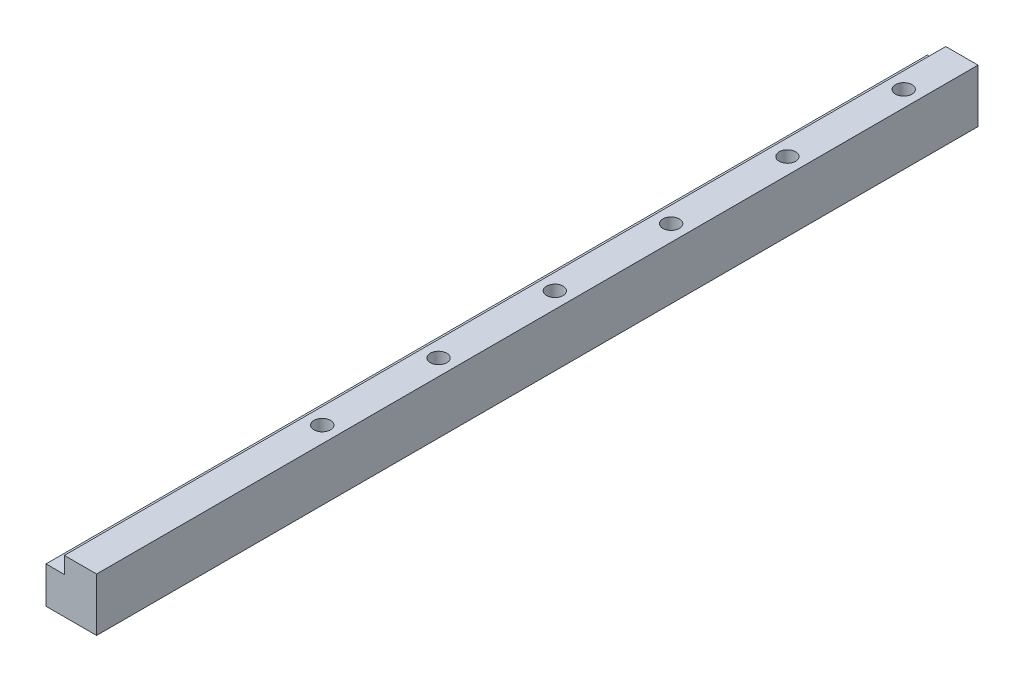
ISO-10303-21;
HEADER;
FILE_DESCRIPTION(('STEP AP214'),'2;1');
FILE_NAME('part.step','',(''),(''),'','','');
FILE_SCHEMA(('AUTOMOTIVE_DESIGN { 1 0 10303 214 1 1 1 1 }'));
ENDSEC;
DATA;
#1=APPLICATION_CONTEXT('core data for automotive mechanical design processes');
#2=APPLICATION_PROTOCOL_DEFINITION('international standard','automotive_design',2000,#1);
#3=PRODUCT_CONTEXT('',#1,'mechanical');
#4=PRODUCT('Part','Part','',(#3));
#5=PRODUCT_RELATED_PRODUCT_CATEGORY('part','',(#4));
#6=PRODUCT_DEFINITION_FORMATION('','',#4);
#7=PRODUCT_DEFINITION_CONTEXT('part definition',#1,'design');
#8=PRODUCT_DEFINITION('design','',#6,#7);
#9=PRODUCT_DEFINITION_SHAPE('','',#8);
#10=(LENGTH_UNIT() NAMED_UNIT(*) SI_UNIT(.MILLI.,.METRE.));
#11=(NAMED_UNIT(*) PLANE_ANGLE_UNIT() SI_UNIT($,.RADIAN.));
#12=(NAMED_UNIT(*) SI_UNIT($,.STERADIAN.) SOLID_ANGLE_UNIT());
#13=UNCERTAINTY_MEASURE_WITH_UNIT(LENGTH_MEASURE(1.E-05),#10,'distance_accuracy_value','');
#14=(GEOMETRIC_REPRESENTATION_CONTEXT(3) GLOBAL_UNCERTAINTY_ASSIGNED_CONTEXT((#13)) GLOBAL_UNIT_ASSIGNED_CONTEXT((#10,
#11,#12)) REPRESENTATION_CONTEXT('',''));
#15=CARTESIAN_POINT('',(0.,0.,0.));
#16=DIRECTION('',(0.,0.,1.));
#17=DIRECTION('',(1.,0.,0.));
#18=AXIS2_PLACEMENT_3D('',#15,#16,#17);
#19=CARTESIAN_POINT('',(-13.7770771845717,0.,100.));
#20=DIRECTION('',(1.,0.,0.));
#21=DIRECTION('',(0.,1.,0.));
#22=AXIS2_PLACEMENT_3D('',#19,#20,#21);
#23=PLANE('',#22);
#24=DIRECTION('',(0.,-1.,0.));
#25=VECTOR('',#24,1.);
#26=CARTESIAN_POINT('',(-13.7770771845717,0.,-100.));
#27=LINE('',#26,#25);
#28=CARTESIAN_POINT('',(-13.7770771845717,10.,-100.));
#29=VERTEX_POINT('',#28);
#30=CARTESIAN_POINT('',(-13.7770771845717,0.,-100.));
#31=VERTEX_POINT('',#30);
#32=EDGE_CURVE('E151',#29,#31,#27,.T.);
#33=ORIENTED_EDGE('',*,*,#32,.T.);
#34=DIRECTION('',(0.,0.,-1.));
#35=VECTOR('',#34,1.);
#36=CARTESIAN_POINT('',(-13.7770771845717,0.,100.));
#37=LINE('',#36,#35);
#38=CARTESIAN_POINT('',(-13.7770771845717,0.,140.));
#39=VERTEX_POINT('',#38);
#40=EDGE_CURVE('E11',#39,#31,#37,.T.);
#41=ORIENTED_EDGE('',*,*,#40,.F.);
#42=DIRECTION('',(0.,-1.,0.));
#43=VECTOR('',#42,1.);
#44=CARTESIAN_POINT('',(-13.7770771845717,10.,140.));
#45=LINE('',#44,#43);
#46=CARTESIAN_POINT('',(-13.7770771845717,10.,140.));
#47=VERTEX_POINT('',#46);
#48=EDGE_CURVE('E95',#47,#39,#45,.T.);
#49=ORIENTED_EDGE('',*,*,#48,.F.);
#50=DIRECTION('',(0.,0.,-1.));
#51=VECTOR('',#50,1.);
#52=CARTESIAN_POINT('',(-13.7770771845717,10.,100.));
#53=LINE('',#52,#51);
#54=EDGE_CURVE('E84',#47,#29,#53,.T.);
#55=ORIENTED_EDGE('',*,*,#54,.T.);
#56=EDGE_LOOP('',(#33,#41,#49,#55));
#57=FACE_BOUND('',#56,.T.);
#58=ADVANCED_FACE('F33',(#57),#23,.F.);
#59=CARTESIAN_POINT('',(0.,0.,100.));
#60=DIRECTION('',(0.,1.,0.));
#61=DIRECTION('',(0.,0.,1.));
#62=AXIS2_PLACEMENT_3D('',#59,#60,#61);
#63=PLANE('',#62);
#64=CARTESIAN_POINT('',(-4.3885385922859,0.,-84.1666666666667));
#65=DIRECTION('',(0.,1.,0.));
#66=DIRECTION('',(0.,0.,1.));
#67=AXIS2_PLACEMENT_3D('',#64,#65,#66);
#68=CIRCLE('',#67,2.25);
#69=CARTESIAN_POINT('',(-4.3885385922859,0.,-81.9166666666667));
#70=VERTEX_POINT('',#69);
#71=EDGE_CURVE('E118',#70,#70,#68,.T.);
#72=ORIENTED_EDGE('',*,*,#71,.T.);
#73=EDGE_LOOP('',(#72));
#74=FACE_BOUND('',#73,.T.);
#75=CARTESIAN_POINT('',(-4.38853859228589,0.,-52.5));
#76=DIRECTION('',(0.,1.,0.));
#77=DIRECTION('',(0.,0.,1.));
#78=AXIS2_PLACEMENT_3D('',#75,#76,#77);
#79=CIRCLE('',#78,2.25);
#80=CARTESIAN_POINT('',(-4.38853859228589,0.,-50.25));
#81=VERTEX_POINT('',#80);
#82=EDGE_CURVE('E124',#81,#81,#79,.T.);
#83=ORIENTED_EDGE('',*,*,#82,.T.);
#84=EDGE_LOOP('',(#83));
#85=FACE_BOUND('',#84,.T.);
#86=CARTESIAN_POINT('',(-4.38853859228589,0.,-20.8333333333333));
#87=DIRECTION('',(0.,1.,0.));
#88=DIRECTION('',(0.,0.,1.));
#89=AXIS2_PLACEMENT_3D('',#86,#87,#88);
#90=CIRCLE('',#89,2.25);
#91=CARTESIAN_POINT('',(-4.38853859228589,0.,-18.5833333333333));
#92=VERTEX_POINT('',#91);
#93=EDGE_CURVE('E130',#92,#92,#90,.T.);
#94=ORIENTED_EDGE('',*,*,#93,.T.);
#95=EDGE_LOOP('',(#94));
#96=FACE_BOUND('',#95,.T.);
#97=CARTESIAN_POINT('',(-4.38853859228588,0.,10.8333333333333));
#98=DIRECTION('',(0.,1.,0.));
#99=DIRECTION('',(0.,0.,1.));
#100=AXIS2_PLACEMENT_3D('',#97,#98,#99);
#101=CIRCLE('',#100,2.25);
#102=CARTESIAN_POINT('',(-4.38853859228588,0.,13.0833333333333));
#103=VERTEX_POINT('',#102);
#104=EDGE_CURVE('E136',#103,#103,#101,.T.);
#105=ORIENTED_EDGE('',*,*,#104,.T.);
#106=EDGE_LOOP('',(#105));
#107=FACE_BOUND('',#106,.T.);
#108=CARTESIAN_POINT('',(-4.38853859228588,0.,42.5));
#109=DIRECTION('',(0.,1.,0.));
#110=DIRECTION('',(0.,0.,1.));
#111=AXIS2_PLACEMENT_3D('',#108,#109,#110);
#112=CIRCLE('',#111,2.25);
#113=CARTESIAN_POINT('',(-4.38853859228588,0.,44.75));
#114=VERTEX_POINT('',#113);
#115=EDGE_CURVE('E142',#114,#114,#112,.T.);
#116=ORIENTED_EDGE('',*,*,#115,.T.);
#117=EDGE_LOOP('',(#116));
#118=FACE_BOUND('',#117,.T.);
#119=CARTESIAN_POINT('',(-4.38853859228588,0.,74.1666666666667));
#120=DIRECTION('',(0.,1.,0.));
#121=DIRECTION('',(0.,0.,1.));
#122=AXIS2_PLACEMENT_3D('',#119,#120,#121);
#123=CIRCLE('',#122,2.25);
#124=CARTESIAN_POINT('',(-4.38853859228588,0.,76.4166666666667));
#125=VERTEX_POINT('',#124);
#126=EDGE_CURVE('E148',#125,#125,#123,.T.);
#127=ORIENTED_EDGE('',*,*,#126,.T.);
#128=EDGE_LOOP('',(#127));
#129=FACE_BOUND('',#128,.T.);
#130=DIRECTION('',(1.,0.,0.));
#131=VECTOR('',#130,1.);
#132=CARTESIAN_POINT('',(0.,0.,-100.));
#133=LINE('',#132,#131);
#134=CARTESIAN_POINT('',(0.,0.,-100.));
#135=VERTEX_POINT('',#134);
#136=EDGE_CURVE('E153',#31,#135,#133,.T.);
#137=ORIENTED_EDGE('',*,*,#136,.T.);
#138=DIRECTION('',(0.,0.,-1.));
#139=VECTOR('',#138,1.);
#140=CARTESIAN_POINT('',(0.,0.,100.));
#141=LINE('',#140,#139);
#142=CARTESIAN_POINT('',(0.,0.,140.));
#143=VERTEX_POINT('',#142);
#144=EDGE_CURVE('E40',#143,#135,#141,.T.);
#145=ORIENTED_EDGE('',*,*,#144,.F.);
#146=DIRECTION('',(1.,0.,0.));
#147=VECTOR('',#146,1.);
#148=CARTESIAN_POINT('',(-13.7770771845717,0.,140.));
#149=LINE('',#148,#147);
#150=EDGE_CURVE('E99',#39,#143,#149,.T.);
#151=ORIENTED_EDGE('',*,*,#150,.F.);
#152=ORIENTED_EDGE('',*,*,#40,.T.);
#153=EDGE_LOOP('',(#137,#145,#151,#152));
#154=FACE_BOUND('',#153,.T.);
#155=ADVANCED_FACE('F189',(#74,#85,#96,#107,#118,#129,#154),#63,.F.);
#156=CARTESIAN_POINT('',(0.,14.5,100.));
#157=DIRECTION('',(-1.,0.,0.));
#158=DIRECTION('',(0.,-1.,0.));
#159=AXIS2_PLACEMENT_3D('',#156,#157,#158);
#160=PLANE('',#159);
#161=DIRECTION('',(0.,1.,0.));
#162=VECTOR('',#161,1.);
#163=CARTESIAN_POINT('',(0.,14.5,-100.));
#164=LINE('',#163,#162);
#165=CARTESIAN_POINT('',(0.,14.5,-100.));
#166=VERTEX_POINT('',#165);
#167=EDGE_CURVE('E155',#135,#166,#164,.T.);
#168=ORIENTED_EDGE('',*,*,#167,.T.);
#169=DIRECTION('',(0.,0.,-1.));
#170=VECTOR('',#169,1.);
#171=CARTESIAN_POINT('',(0.,14.5,100.));
#172=LINE('',#171,#170);
#173=CARTESIAN_POINT('',(0.,14.5,140.));
#174=VERTEX_POINT('',#173);
#175=EDGE_CURVE('E164',#174,#166,#172,.T.);
#176=ORIENTED_EDGE('',*,*,#175,.F.);
#177=DIRECTION('',(0.,1.,0.));
#178=VECTOR('',#177,1.);
#179=CARTESIAN_POINT('',(0.,0.,140.));
#180=LINE('',#179,#178);
#181=EDGE_CURVE('E109',#143,#174,#180,.T.);
#182=ORIENTED_EDGE('',*,*,#181,.F.);
#183=ORIENTED_EDGE('',*,*,#144,.T.);
#184=EDGE_LOOP('',(#168,#176,#182,#183));
#185=FACE_BOUND('',#184,.T.);
#186=ADVANCED_FACE('F170',(#185),#160,.F.);
#187=CARTESIAN_POINT('',(-8.77707718457179,14.5,100.));
#188=DIRECTION('',(0.,-1.,0.));
#189=DIRECTION('',(0.,0.,-1.));
#190=AXIS2_PLACEMENT_3D('',#187,#188,#189);
#191=PLANE('',#190);
#192=CARTESIAN_POINT('',(-4.3885385922859,14.5,-84.1666666666667));
#193=DIRECTION('',(0.,1.,0.));
#194=DIRECTION('',(0.,0.,1.));
#195=AXIS2_PLACEMENT_3D('',#192,#193,#194);
#196=CIRCLE('',#195,2.24999999999999);
#197=CARTESIAN_POINT('',(-4.3885385922859,14.5,-81.9166666666667));
#198=VERTEX_POINT('',#197);
#199=EDGE_CURVE('E115',#198,#198,#196,.T.);
#200=ORIENTED_EDGE('',*,*,#199,.F.);
#201=EDGE_LOOP('',(#200));
#202=FACE_BOUND('',#201,.T.);
#203=CARTESIAN_POINT('',(-4.38853859228589,14.5,-52.5));
#204=DIRECTION('',(0.,1.,0.));
#205=DIRECTION('',(0.,0.,1.));
#206=AXIS2_PLACEMENT_3D('',#203,#204,#205);
#207=CIRCLE('',#206,2.24999999999999);
#208=CARTESIAN_POINT('',(-4.38853859228589,14.5,-50.25));
#209=VERTEX_POINT('',#208);
#210=EDGE_CURVE('E121',#209,#209,#207,.T.);
#211=ORIENTED_EDGE('',*,*,#210,.F.);
#212=EDGE_LOOP('',(#211));
#213=FACE_BOUND('',#212,.T.);
#214=CARTESIAN_POINT('',(-4.38853859228589,14.5,-20.8333333333333));
#215=DIRECTION('',(0.,1.,0.));
#216=DIRECTION('',(0.,0.,1.));
#217=AXIS2_PLACEMENT_3D('',#214,#215,#216);
#218=CIRCLE('',#217,2.24999999999999);
#219=CARTESIAN_POINT('',(-4.38853859228589,14.5,-18.5833333333334));
#220=VERTEX_POINT('',#219);
#221=EDGE_CURVE('E127',#220,#220,#218,.T.);
#222=ORIENTED_EDGE('',*,*,#221,.F.);
#223=EDGE_LOOP('',(#222));
#224=FACE_BOUND('',#223,.T.);
#225=CARTESIAN_POINT('',(-4.38853859228588,14.5,10.8333333333333));
#226=DIRECTION('',(0.,1.,0.));
#227=DIRECTION('',(0.,0.,1.));
#228=AXIS2_PLACEMENT_3D('',#225,#226,#227);
#229=CIRCLE('',#228,2.24999999999999);
#230=CARTESIAN_POINT('',(-4.38853859228588,14.5,13.0833333333333));
#231=VERTEX_POINT('',#230);
#232=EDGE_CURVE('E133',#231,#231,#229,.T.);
#233=ORIENTED_EDGE('',*,*,#232,.F.);
#234=EDGE_LOOP('',(#233));
#235=FACE_BOUND('',#234,.T.);
#236=CARTESIAN_POINT('',(-4.38853859228588,14.5,42.5));
#237=DIRECTION('',(0.,1.,0.));
#238=DIRECTION('',(0.,0.,1.));
#239=AXIS2_PLACEMENT_3D('',#236,#237,#238);
#240=CIRCLE('',#239,2.24999999999999);
#241=CARTESIAN_POINT('',(-4.38853859228588,14.5,44.75));
#242=VERTEX_POINT('',#241);
#243=EDGE_CURVE('E139',#242,#242,#240,.T.);
#244=ORIENTED_EDGE('',*,*,#243,.F.);
#245=EDGE_LOOP('',(#244));
#246=FACE_BOUND('',#245,.T.);
#247=CARTESIAN_POINT('',(-4.38853859228588,14.5,74.1666666666667));
#248=DIRECTION('',(0.,1.,0.));
#249=DIRECTION('',(0.,0.,1.));
#250=AXIS2_PLACEMENT_3D('',#247,#248,#249);
#251=CIRCLE('',#250,2.24999999999999);
#252=CARTESIAN_POINT('',(-4.38853859228588,14.5,76.4166666666666));
#253=VERTEX_POINT('',#252);
#254=EDGE_CURVE('E145',#253,#253,#251,.T.);
#255=ORIENTED_EDGE('',*,*,#254,.F.);
#256=EDGE_LOOP('',(#255));
#257=FACE_BOUND('',#256,.T.);
#258=DIRECTION('',(-1.,0.,0.));
#259=VECTOR('',#258,1.);
#260=CARTESIAN_POINT('',(-8.77707718457179,14.5,-100.));
#261=LINE('',#260,#259);
#262=CARTESIAN_POINT('',(-8.77707718457179,14.5,-100.));
#263=VERTEX_POINT('',#262);
#264=EDGE_CURVE('E157',#166,#263,#261,.T.);
#265=ORIENTED_EDGE('',*,*,#264,.T.);
#266=DIRECTION('',(0.,0.,-1.));
#267=VECTOR('',#266,1.);
#268=CARTESIAN_POINT('',(-8.77707718457179,14.5,100.));
#269=LINE('',#268,#267);
#270=CARTESIAN_POINT('',(-8.77707718457179,14.5,140.));
#271=VERTEX_POINT('',#270);
#272=EDGE_CURVE('E162',#271,#263,#269,.T.);
#273=ORIENTED_EDGE('',*,*,#272,.F.);
#274=DIRECTION('',(-1.,0.,0.));
#275=VECTOR('',#274,1.);
#276=CARTESIAN_POINT('',(0.,14.5,140.));
#277=LINE('',#276,#275);
#278=EDGE_CURVE('E112',#174,#271,#277,.T.);
#279=ORIENTED_EDGE('',*,*,#278,.F.);
#280=ORIENTED_EDGE('',*,*,#175,.T.);
#281=EDGE_LOOP('',(#265,#273,#279,#280));
#282=FACE_BOUND('',#281,.T.);
#283=ADVANCED_FACE('F176',(#202,#213,#224,#235,#246,#257,#282),#191,.F.);
#284=CARTESIAN_POINT('',(-8.77707718457179,10.,100.));
#285=DIRECTION('',(1.,0.,0.));
#286=DIRECTION('',(0.,1.,0.));
#287=AXIS2_PLACEMENT_3D('',#284,#285,#286);
#288=PLANE('',#287);
#289=DIRECTION('',(0.,-1.,0.));
#290=VECTOR('',#289,1.);
#291=CARTESIAN_POINT('',(-8.77707718457179,10.,-100.));
#292=LINE('',#291,#290);
#293=CARTESIAN_POINT('',(-8.77707718457179,10.,-100.));
#294=VERTEX_POINT('',#293);
#295=EDGE_CURVE('E55',#263,#294,#292,.T.);
#296=ORIENTED_EDGE('',*,*,#295,.T.);
#297=DIRECTION('',(0.,0.,-1.));
#298=VECTOR('',#297,1.);
#299=CARTESIAN_POINT('',(-8.77707718457179,10.,100.));
#300=LINE('',#299,#298);
#301=CARTESIAN_POINT('',(-8.77707718457179,10.,140.));
#302=VERTEX_POINT('',#301);
#303=EDGE_CURVE('E92',#302,#294,#300,.T.);
#304=ORIENTED_EDGE('',*,*,#303,.F.);
#305=DIRECTION('',(0.,-1.,0.));
#306=VECTOR('',#305,1.);
#307=CARTESIAN_POINT('',(-8.77707718457179,14.5,140.));
#308=LINE('',#307,#306);
#309=EDGE_CURVE('E105',#271,#302,#308,.T.);
#310=ORIENTED_EDGE('',*,*,#309,.F.);
#311=ORIENTED_EDGE('',*,*,#272,.T.);
#312=EDGE_LOOP('',(#296,#304,#310,#311));
#313=FACE_BOUND('',#312,.T.);
#314=ADVANCED_FACE('F178',(#313),#288,.F.);
#315=CARTESIAN_POINT('',(-13.7770771845717,10.,100.));
#316=DIRECTION('',(0.,-1.,0.));
#317=DIRECTION('',(0.,0.,-1.));
#318=AXIS2_PLACEMENT_3D('',#315,#316,#317);
#319=PLANE('',#318);
#320=DIRECTION('',(-1.,0.,0.));
#321=VECTOR('',#320,1.);
#322=CARTESIAN_POINT('',(-13.7770771845717,10.,-100.));
#323=LINE('',#322,#321);
#324=EDGE_CURVE('E47',#294,#29,#323,.T.);
#325=ORIENTED_EDGE('',*,*,#324,.T.);
#326=ORIENTED_EDGE('',*,*,#54,.F.);
#327=DIRECTION('',(-1.,0.,0.));
#328=VECTOR('',#327,1.);
#329=CARTESIAN_POINT('',(-8.77707718457179,10.,140.));
#330=LINE('',#329,#328);
#331=EDGE_CURVE('E88',#302,#47,#330,.T.);
#332=ORIENTED_EDGE('',*,*,#331,.F.);
#333=ORIENTED_EDGE('',*,*,#303,.T.);
#334=EDGE_LOOP('',(#325,#326,#332,#333));
#335=FACE_BOUND('',#334,.T.);
#336=ADVANCED_FACE('F86',(#335),#319,.F.);
#337=CARTESIAN_POINT('',(0.,0.,-100.));
#338=DIRECTION('',(0.,0.,-1.));
#339=DIRECTION('',(-1.,0.,0.));
#340=AXIS2_PLACEMENT_3D('',#337,#338,#339);
#341=PLANE('',#340);
#342=ORIENTED_EDGE('',*,*,#32,.F.);
#343=ORIENTED_EDGE('',*,*,#324,.F.);
#344=ORIENTED_EDGE('',*,*,#295,.F.);
#345=ORIENTED_EDGE('',*,*,#264,.F.);
#346=ORIENTED_EDGE('',*,*,#167,.F.);
#347=ORIENTED_EDGE('',*,*,#136,.F.);
#348=EDGE_LOOP('',(#342,#343,#344,#345,#346,#347));
#349=FACE_BOUND('',#348,.T.);
#350=ADVANCED_FACE('F174',(#349),#341,.T.);
#351=CARTESIAN_POINT('',(-4.38853859228588,14.5,74.1666666666667));
#352=DIRECTION('',(0.,1.,0.));
#353=DIRECTION('',(0.,0.,1.));
#354=AXIS2_PLACEMENT_3D('',#351,#352,#353);
#355=CYLINDRICAL_SURFACE('',#354,2.24999999999999);
#356=ORIENTED_EDGE('',*,*,#126,.F.);
#357=EDGE_LOOP('',(#356));
#358=FACE_BOUND('',#357,.T.);
#359=ORIENTED_EDGE('',*,*,#254,.T.);
#360=EDGE_LOOP('',(#359));
#361=FACE_BOUND('',#360,.T.);
#362=ADVANCED_FACE('F211',(#358,#361),#355,.F.);
#363=CARTESIAN_POINT('',(-4.38853859228588,14.5,42.5));
#364=DIRECTION('',(0.,1.,0.));
#365=DIRECTION('',(0.,0.,1.));
#366=AXIS2_PLACEMENT_3D('',#363,#364,#365);
#367=CYLINDRICAL_SURFACE('',#366,2.24999999999999);
#368=ORIENTED_EDGE('',*,*,#115,.F.);
#369=EDGE_LOOP('',(#368));
#370=FACE_BOUND('',#369,.T.);
#371=ORIENTED_EDGE('',*,*,#243,.T.);
#372=EDGE_LOOP('',(#371));
#373=FACE_BOUND('',#372,.T.);
#374=ADVANCED_FACE('F214',(#370,#373),#367,.F.);
#375=CARTESIAN_POINT('',(-4.38853859228588,14.5,10.8333333333333));
#376=DIRECTION('',(0.,1.,0.));
#377=DIRECTION('',(0.,0.,1.));
#378=AXIS2_PLACEMENT_3D('',#375,#376,#377);
#379=CYLINDRICAL_SURFACE('',#378,2.24999999999999);
#380=ORIENTED_EDGE('',*,*,#104,.F.);
#381=EDGE_LOOP('',(#380));
#382=FACE_BOUND('',#381,.T.);
#383=ORIENTED_EDGE('',*,*,#232,.T.);
#384=EDGE_LOOP('',(#383));
#385=FACE_BOUND('',#384,.T.);
#386=ADVANCED_FACE('F222',(#382,#385),#379,.F.);
#387=CARTESIAN_POINT('',(-4.38853859228589,14.5,-20.8333333333333));
#388=DIRECTION('',(0.,1.,0.));
#389=DIRECTION('',(0.,0.,1.));
#390=AXIS2_PLACEMENT_3D('',#387,#388,#389);
#391=CYLINDRICAL_SURFACE('',#390,2.24999999999999);
#392=ORIENTED_EDGE('',*,*,#93,.F.);
#393=EDGE_LOOP('',(#392));
#394=FACE_BOUND('',#393,.T.);
#395=ORIENTED_EDGE('',*,*,#221,.T.);
#396=EDGE_LOOP('',(#395));
#397=FACE_BOUND('',#396,.T.);
#398=ADVANCED_FACE('F229',(#394,#397),#391,.F.);
#399=CARTESIAN_POINT('',(-4.38853859228589,14.5,-52.5));
#400=DIRECTION('',(0.,1.,0.));
#401=DIRECTION('',(0.,0.,1.));
#402=AXIS2_PLACEMENT_3D('',#399,#400,#401);
#403=CYLINDRICAL_SURFACE('',#402,2.24999999999999);
#404=ORIENTED_EDGE('',*,*,#82,.F.);
#405=EDGE_LOOP('',(#404));
#406=FACE_BOUND('',#405,.T.);
#407=ORIENTED_EDGE('',*,*,#210,.T.);
#408=EDGE_LOOP('',(#407));
#409=FACE_BOUND('',#408,.T.);
#410=ADVANCED_FACE('F233',(#406,#409),#403,.F.);
#411=CARTESIAN_POINT('',(-4.3885385922859,14.5,-84.1666666666667));
#412=DIRECTION('',(0.,1.,0.));
#413=DIRECTION('',(0.,0.,1.));
#414=AXIS2_PLACEMENT_3D('',#411,#412,#413);
#415=CYLINDRICAL_SURFACE('',#414,2.24999999999999);
#416=ORIENTED_EDGE('',*,*,#71,.F.);
#417=EDGE_LOOP('',(#416));
#418=FACE_BOUND('',#417,.T.);
#419=ORIENTED_EDGE('',*,*,#199,.T.);
#420=EDGE_LOOP('',(#419));
#421=FACE_BOUND('',#420,.T.);
#422=ADVANCED_FACE('F237',(#418,#421),#415,.F.);
#423=CARTESIAN_POINT('',(0.,0.,140.));
#424=DIRECTION('',(0.,0.,1.));
#425=DIRECTION('',(1.,0.,0.));
#426=AXIS2_PLACEMENT_3D('',#423,#424,#425);
#427=PLANE('',#426);
#428=ORIENTED_EDGE('',*,*,#331,.T.);
#429=ORIENTED_EDGE('',*,*,#48,.T.);
#430=ORIENTED_EDGE('',*,*,#150,.T.);
#431=ORIENTED_EDGE('',*,*,#181,.T.);
#432=ORIENTED_EDGE('',*,*,#278,.T.);
#433=ORIENTED_EDGE('',*,*,#309,.T.);
#434=EDGE_LOOP('',(#428,#429,#430,#431,#432,#433));
#435=FACE_BOUND('',#434,.T.);
#436=ADVANCED_FACE('F102',(#435),#427,.T.);
#437=CLOSED_SHELL('',(#58,#155,#186,#283,#314,#336,#350,#362,#374,#386,#398,#410,#422,#436));
#438=MANIFOLD_SOLID_BREP('B2',#437);
#439=ADVANCED_BREP_SHAPE_REPRESENTATION('',(#18,#438),#14);
#440=SHAPE_DEFINITION_REPRESENTATION(#9,#439);
ENDSEC;
END-ISO-10303-21;
